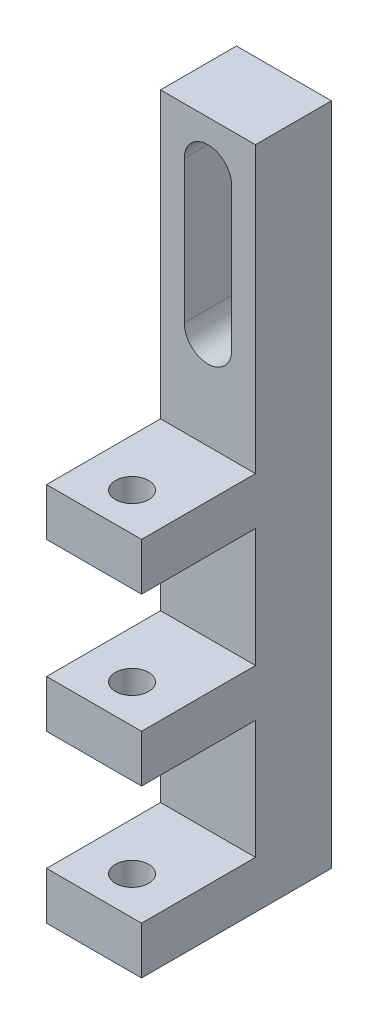
ISO-10303-21;
HEADER;
FILE_DESCRIPTION(('STEP AP214'),'2;1');
FILE_NAME('part.step','',(''),(''),'','','');
FILE_SCHEMA(('AUTOMOTIVE_DESIGN { 1 0 10303 214 1 1 1 1 }'));
ENDSEC;
DATA;
#1=APPLICATION_CONTEXT('core data for automotive mechanical design processes');
#2=APPLICATION_PROTOCOL_DEFINITION('international standard','automotive_design',2000,#1);
#3=PRODUCT_CONTEXT('',#1,'mechanical');
#4=PRODUCT('Part','Part','',(#3));
#5=PRODUCT_RELATED_PRODUCT_CATEGORY('part','',(#4));
#6=PRODUCT_DEFINITION_FORMATION('','',#4);
#7=PRODUCT_DEFINITION_CONTEXT('part definition',#1,'design');
#8=PRODUCT_DEFINITION('design','',#6,#7);
#9=PRODUCT_DEFINITION_SHAPE('','',#8);
#10=(LENGTH_UNIT() NAMED_UNIT(*) SI_UNIT(.MILLI.,.METRE.));
#11=(NAMED_UNIT(*) PLANE_ANGLE_UNIT() SI_UNIT($,.RADIAN.));
#12=(NAMED_UNIT(*) SI_UNIT($,.STERADIAN.) SOLID_ANGLE_UNIT());
#13=UNCERTAINTY_MEASURE_WITH_UNIT(LENGTH_MEASURE(1.E-05),#10,'distance_accuracy_value','');
#14=(GEOMETRIC_REPRESENTATION_CONTEXT(3) GLOBAL_UNCERTAINTY_ASSIGNED_CONTEXT((#13)) GLOBAL_UNIT_ASSIGNED_CONTEXT((#10,
#11,#12)) REPRESENTATION_CONTEXT('',''));
#15=CARTESIAN_POINT('',(0.,0.,0.));
#16=DIRECTION('',(0.,0.,1.));
#17=DIRECTION('',(1.,0.,0.));
#18=AXIS2_PLACEMENT_3D('',#15,#16,#17);
#19=CARTESIAN_POINT('',(0.505617977528097,15.2247191011236,5.));
#20=DIRECTION('',(0.,0.,-1.));
#21=DIRECTION('',(-1.,0.,0.));
#22=AXIS2_PLACEMENT_3D('',#19,#20,#21);
#23=CYLINDRICAL_SURFACE('',#22,2.5);
#24=CARTESIAN_POINT('',(0.505617977528097,15.2247191011236,5.));
#25=DIRECTION('',(0.,0.,1.));
#26=DIRECTION('',(1.,0.,0.));
#27=AXIS2_PLACEMENT_3D('',#24,#25,#26);
#28=CIRCLE('',#27,2.5);
#29=CARTESIAN_POINT('',(-1.9943820224719,15.2247191011236,5.));
#30=VERTEX_POINT('',#29);
#31=CARTESIAN_POINT('',(3.0056179775281,15.2247191011236,5.));
#32=VERTEX_POINT('',#31);
#33=EDGE_CURVE('E316',#30,#32,#28,.T.);
#34=ORIENTED_EDGE('',*,*,#33,.T.);
#35=DIRECTION('',(0.,0.,1.));
#36=VECTOR('',#35,1.);
#37=CARTESIAN_POINT('',(3.0056179775281,15.2247191011236,-3.));
#38=LINE('',#37,#36);
#39=CARTESIAN_POINT('',(3.0056179775281,15.2247191011236,-3.));
#40=VERTEX_POINT('',#39);
#41=EDGE_CURVE('E167',#40,#32,#38,.T.);
#42=ORIENTED_EDGE('',*,*,#41,.F.);
#43=CARTESIAN_POINT('',(0.505617977528097,15.2247191011236,-3.));
#44=DIRECTION('',(0.,0.,1.));
#45=DIRECTION('',(1.,0.,0.));
#46=AXIS2_PLACEMENT_3D('',#43,#44,#45);
#47=CIRCLE('',#46,2.5);
#48=CARTESIAN_POINT('',(-1.9943820224719,15.2247191011236,-3.));
#49=VERTEX_POINT('',#48);
#50=EDGE_CURVE('E163',#40,#49,#47,.F.);
#51=ORIENTED_EDGE('',*,*,#50,.T.);
#52=DIRECTION('',(0.,0.,1.));
#53=VECTOR('',#52,1.);
#54=CARTESIAN_POINT('',(-1.9943820224719,15.2247191011236,-3.));
#55=LINE('',#54,#53);
#56=EDGE_CURVE('E165',#49,#30,#55,.T.);
#57=ORIENTED_EDGE('',*,*,#56,.T.);
#58=EDGE_LOOP('',(#34,#42,#51,#57));
#59=FACE_BOUND('',#58,.T.);
#60=ADVANCED_FACE('F37',(#59),#23,.F.);
#61=CARTESIAN_POINT('',(0.,0.,5.));
#62=DIRECTION('',(0.,0.,1.));
#63=DIRECTION('',(1.,0.,0.));
#64=AXIS2_PLACEMENT_3D('',#61,#62,#63);
#65=PLANE('',#64);
#66=DIRECTION('',(1.,0.,0.));
#67=VECTOR('',#66,1.);
#68=CARTESIAN_POINT('',(0.,5.2247191011236,5.));
#69=LINE('',#68,#67);
#70=CARTESIAN_POINT('',(-4.4943820224719,5.2247191011236,5.));
#71=VERTEX_POINT('',#70);
#72=CARTESIAN_POINT('',(5.5056179775281,5.2247191011236,5.));
#73=VERTEX_POINT('',#72);
#74=EDGE_CURVE('E318',#71,#73,#69,.T.);
#75=ORIENTED_EDGE('',*,*,#74,.T.);
#76=DIRECTION('',(0.,1.,0.));
#77=VECTOR('',#76,1.);
#78=CARTESIAN_POINT('',(5.50561797752809,0.,5.));
#79=LINE('',#78,#77);
#80=CARTESIAN_POINT('',(5.5056179775281,35.2247191011236,5.));
#81=VERTEX_POINT('',#80);
#82=EDGE_CURVE('E45',#73,#81,#79,.T.);
#83=ORIENTED_EDGE('',*,*,#82,.T.);
#84=DIRECTION('',(-1.,0.,0.));
#85=VECTOR('',#84,1.);
#86=CARTESIAN_POINT('',(-4.4943820224719,35.2247191011236,5.));
#87=LINE('',#86,#85);
#88=CARTESIAN_POINT('',(-4.4943820224719,35.2247191011236,5.));
#89=VERTEX_POINT('',#88);
#90=EDGE_CURVE('E197',#81,#89,#87,.T.);
#91=ORIENTED_EDGE('',*,*,#90,.T.);
#92=DIRECTION('',(0.,1.,0.));
#93=VECTOR('',#92,1.);
#94=CARTESIAN_POINT('',(-4.4943820224719,0.,5.));
#95=LINE('',#94,#93);
#96=EDGE_CURVE('E11',#71,#89,#95,.T.);
#97=ORIENTED_EDGE('',*,*,#96,.F.);
#98=EDGE_LOOP('',(#75,#83,#91,#97));
#99=FACE_BOUND('',#98,.T.);
#100=CARTESIAN_POINT('',(0.505617977528097,30.2247191011236,5.));
#101=DIRECTION('',(0.,0.,1.));
#102=DIRECTION('',(1.,0.,0.));
#103=AXIS2_PLACEMENT_3D('',#100,#101,#102);
#104=CIRCLE('',#103,2.5);
#105=CARTESIAN_POINT('',(3.0056179775281,30.2247191011236,5.));
#106=VERTEX_POINT('',#105);
#107=CARTESIAN_POINT('',(-1.9943820224719,30.2247191011236,5.));
#108=VERTEX_POINT('',#107);
#109=EDGE_CURVE('E193',#106,#108,#104,.T.);
#110=ORIENTED_EDGE('',*,*,#109,.F.);
#111=DIRECTION('',(0.,-1.,0.));
#112=VECTOR('',#111,1.);
#113=CARTESIAN_POINT('',(3.0056179775281,0.,5.));
#114=LINE('',#113,#112);
#115=EDGE_CURVE('E183',#106,#32,#114,.T.);
#116=ORIENTED_EDGE('',*,*,#115,.T.);
#117=ORIENTED_EDGE('',*,*,#33,.F.);
#118=DIRECTION('',(0.,-1.,0.));
#119=VECTOR('',#118,1.);
#120=CARTESIAN_POINT('',(-1.9943820224719,0.,5.));
#121=LINE('',#120,#119);
#122=EDGE_CURVE('E175',#108,#30,#121,.T.);
#123=ORIENTED_EDGE('',*,*,#122,.F.);
#124=EDGE_LOOP('',(#110,#116,#117,#123));
#125=FACE_BOUND('',#124,.T.);
#126=ADVANCED_FACE('F323',(#99,#125),#65,.T.);
#127=CARTESIAN_POINT('',(-4.4943820224719,25.2247191011236,-3.));
#128=DIRECTION('',(0.,0.,-1.));
#129=DIRECTION('',(0.,1.,0.));
#130=AXIS2_PLACEMENT_3D('',#127,#128,#129);
#131=PLANE('',#130);
#132=DIRECTION('',(0.,1.,0.));
#133=VECTOR('',#132,1.);
#134=CARTESIAN_POINT('',(5.5056179775281,25.2247191011236,-3.));
#135=LINE('',#134,#133);
#136=CARTESIAN_POINT('',(5.50561797752809,-34.7752808988764,-3.00000000000001));
#137=VERTEX_POINT('',#136);
#138=CARTESIAN_POINT('',(5.5056179775281,35.2247191011236,-3.));
#139=VERTEX_POINT('',#138);
#140=EDGE_CURVE('E209',#137,#139,#135,.T.);
#141=ORIENTED_EDGE('',*,*,#140,.F.);
#142=DIRECTION('',(1.,0.,0.));
#143=VECTOR('',#142,1.);
#144=CARTESIAN_POINT('',(-4.49438202247191,-34.7752808988764,-3.00000000000001));
#145=LINE('',#144,#143);
#146=CARTESIAN_POINT('',(-4.49438202247191,-34.7752808988764,-3.00000000000001));
#147=VERTEX_POINT('',#146);
#148=EDGE_CURVE('E214',#147,#137,#145,.T.);
#149=ORIENTED_EDGE('',*,*,#148,.F.);
#150=DIRECTION('',(0.,1.,0.));
#151=VECTOR('',#150,1.);
#152=CARTESIAN_POINT('',(-4.4943820224719,25.2247191011236,-3.));
#153=LINE('',#152,#151);
#154=CARTESIAN_POINT('',(-4.4943820224719,35.2247191011236,-3.));
#155=VERTEX_POINT('',#154);
#156=EDGE_CURVE('E212',#147,#155,#153,.T.);
#157=ORIENTED_EDGE('',*,*,#156,.T.);
#158=DIRECTION('',(-1.,0.,0.));
#159=VECTOR('',#158,1.);
#160=CARTESIAN_POINT('',(-4.4943820224719,35.2247191011236,-3.));
#161=LINE('',#160,#159);
#162=EDGE_CURVE('E200',#139,#155,#161,.T.);
#163=ORIENTED_EDGE('',*,*,#162,.F.);
#164=EDGE_LOOP('',(#141,#149,#157,#163));
#165=FACE_BOUND('',#164,.T.);
#166=ORIENTED_EDGE('',*,*,#50,.F.);
#167=DIRECTION('',(0.,-1.,0.));
#168=VECTOR('',#167,1.);
#169=CARTESIAN_POINT('',(3.0056179775281,0.,-3.));
#170=LINE('',#169,#168);
#171=CARTESIAN_POINT('',(3.0056179775281,30.2247191011236,-3.));
#172=VERTEX_POINT('',#171);
#173=EDGE_CURVE('E171',#172,#40,#170,.T.);
#174=ORIENTED_EDGE('',*,*,#173,.F.);
#175=CARTESIAN_POINT('',(0.505617977528097,30.2247191011236,-3.));
#176=DIRECTION('',(0.,0.,1.));
#177=DIRECTION('',(1.,0.,0.));
#178=AXIS2_PLACEMENT_3D('',#175,#176,#177);
#179=CIRCLE('',#178,2.5);
#180=CARTESIAN_POINT('',(-1.9943820224719,30.2247191011236,-3.));
#181=VERTEX_POINT('',#180);
#182=EDGE_CURVE('E182',#172,#181,#179,.T.);
#183=ORIENTED_EDGE('',*,*,#182,.T.);
#184=DIRECTION('',(0.,-1.,0.));
#185=VECTOR('',#184,1.);
#186=CARTESIAN_POINT('',(-1.9943820224719,0.,-3.));
#187=LINE('',#186,#185);
#188=EDGE_CURVE('E52',#181,#49,#187,.T.);
#189=ORIENTED_EDGE('',*,*,#188,.T.);
#190=EDGE_LOOP('',(#166,#174,#183,#189));
#191=FACE_BOUND('',#190,.T.);
#192=ADVANCED_FACE('F180',(#165,#191),#131,.T.);
#193=CARTESIAN_POINT('',(0.505617977528097,30.2247191011236,-3.));
#194=DIRECTION('',(0.,0.,1.));
#195=DIRECTION('',(1.,0.,0.));
#196=AXIS2_PLACEMENT_3D('',#193,#194,#195);
#197=CYLINDRICAL_SURFACE('',#196,2.5);
#198=DIRECTION('',(0.,0.,1.));
#199=VECTOR('',#198,1.);
#200=CARTESIAN_POINT('',(3.0056179775281,30.2247191011236,-3.));
#201=LINE('',#200,#199);
#202=EDGE_CURVE('E190',#172,#106,#201,.T.);
#203=ORIENTED_EDGE('',*,*,#202,.T.);
#204=ORIENTED_EDGE('',*,*,#109,.T.);
#205=DIRECTION('',(0.,0.,1.));
#206=VECTOR('',#205,1.);
#207=CARTESIAN_POINT('',(-1.9943820224719,30.2247191011236,-3.));
#208=LINE('',#207,#206);
#209=EDGE_CURVE('E177',#181,#108,#208,.T.);
#210=ORIENTED_EDGE('',*,*,#209,.F.);
#211=ORIENTED_EDGE('',*,*,#182,.F.);
#212=EDGE_LOOP('',(#203,#204,#210,#211));
#213=FACE_BOUND('',#212,.T.);
#214=ADVANCED_FACE('F379',(#213),#197,.F.);
#215=CARTESIAN_POINT('',(5.50561797752809,0.,5.));
#216=DIRECTION('',(-1.,0.,0.));
#217=DIRECTION('',(0.,-1.,0.));
#218=AXIS2_PLACEMENT_3D('',#215,#216,#217);
#219=PLANE('',#218);
#220=DIRECTION('',(0.,0.,-1.));
#221=VECTOR('',#220,1.);
#222=CARTESIAN_POINT('',(5.5056179775281,-34.7752808988764,17.));
#223=LINE('',#222,#221);
#224=CARTESIAN_POINT('',(5.5056179775281,-34.7752808988764,17.));
#225=VERTEX_POINT('',#224);
#226=EDGE_CURVE('E245',#225,#137,#223,.T.);
#227=ORIENTED_EDGE('',*,*,#226,.T.);
#228=ORIENTED_EDGE('',*,*,#140,.T.);
#229=DIRECTION('',(0.,0.,1.));
#230=VECTOR('',#229,1.);
#231=CARTESIAN_POINT('',(5.5056179775281,35.2247191011236,-3.));
#232=LINE('',#231,#230);
#233=EDGE_CURVE('E203',#139,#81,#232,.T.);
#234=ORIENTED_EDGE('',*,*,#233,.T.);
#235=ORIENTED_EDGE('',*,*,#82,.F.);
#236=DIRECTION('',(0.,0.,-1.));
#237=VECTOR('',#236,1.);
#238=CARTESIAN_POINT('',(5.5056179775281,5.2247191011236,17.));
#239=LINE('',#238,#237);
#240=CARTESIAN_POINT('',(5.5056179775281,5.2247191011236,17.));
#241=VERTEX_POINT('',#240);
#242=EDGE_CURVE('E308',#241,#73,#239,.T.);
#243=ORIENTED_EDGE('',*,*,#242,.F.);
#244=DIRECTION('',(0.,-1.,0.));
#245=VECTOR('',#244,1.);
#246=CARTESIAN_POINT('',(5.5056179775281,0.,17.));
#247=LINE('',#246,#245);
#248=CARTESIAN_POINT('',(5.5056179775281,0.224719101123605,17.));
#249=VERTEX_POINT('',#248);
#250=EDGE_CURVE('E299',#241,#249,#247,.T.);
#251=ORIENTED_EDGE('',*,*,#250,.T.);
#252=DIRECTION('',(0.,0.,-1.));
#253=VECTOR('',#252,1.);
#254=CARTESIAN_POINT('',(5.5056179775281,0.224719101123605,17.));
#255=LINE('',#254,#253);
#256=CARTESIAN_POINT('',(5.5056179775281,0.224719101123605,5.));
#257=VERTEX_POINT('',#256);
#258=EDGE_CURVE('E310',#249,#257,#255,.T.);
#259=ORIENTED_EDGE('',*,*,#258,.T.);
#260=DIRECTION('',(0.,-1.,0.));
#261=VECTOR('',#260,1.);
#262=CARTESIAN_POINT('',(5.5056179775281,0.,5.));
#263=LINE('',#262,#261);
#264=CARTESIAN_POINT('',(5.5056179775281,-12.2752808988764,5.));
#265=VERTEX_POINT('',#264);
#266=EDGE_CURVE('E288',#257,#265,#263,.T.);
#267=ORIENTED_EDGE('',*,*,#266,.T.);
#268=DIRECTION('',(0.,0.,-1.));
#269=VECTOR('',#268,1.);
#270=CARTESIAN_POINT('',(5.5056179775281,-12.2752808988764,17.));
#271=LINE('',#270,#269);
#272=CARTESIAN_POINT('',(5.5056179775281,-12.2752808988764,17.));
#273=VERTEX_POINT('',#272);
#274=EDGE_CURVE('E274',#273,#265,#271,.T.);
#275=ORIENTED_EDGE('',*,*,#274,.F.);
#276=DIRECTION('',(0.,-1.,0.));
#277=VECTOR('',#276,1.);
#278=CARTESIAN_POINT('',(5.5056179775281,0.,17.));
#279=LINE('',#278,#277);
#280=CARTESIAN_POINT('',(5.5056179775281,-17.2752808988764,17.));
#281=VERTEX_POINT('',#280);
#282=EDGE_CURVE('E265',#273,#281,#279,.T.);
#283=ORIENTED_EDGE('',*,*,#282,.T.);
#284=DIRECTION('',(0.,0.,-1.));
#285=VECTOR('',#284,1.);
#286=CARTESIAN_POINT('',(5.5056179775281,-17.2752808988764,17.));
#287=LINE('',#286,#285);
#288=CARTESIAN_POINT('',(5.5056179775281,-17.2752808988764,5.));
#289=VERTEX_POINT('',#288);
#290=EDGE_CURVE('E276',#281,#289,#287,.T.);
#291=ORIENTED_EDGE('',*,*,#290,.T.);
#292=DIRECTION('',(0.,-1.,0.));
#293=VECTOR('',#292,1.);
#294=CARTESIAN_POINT('',(5.5056179775281,0.,5.));
#295=LINE('',#294,#293);
#296=CARTESIAN_POINT('',(5.5056179775281,-29.7752808988764,5.));
#297=VERTEX_POINT('',#296);
#298=EDGE_CURVE('E60',#289,#297,#295,.T.);
#299=ORIENTED_EDGE('',*,*,#298,.T.);
#300=DIRECTION('',(0.,0.,-1.));
#301=VECTOR('',#300,1.);
#302=CARTESIAN_POINT('',(5.5056179775281,-29.7752808988764,17.));
#303=LINE('',#302,#301);
#304=CARTESIAN_POINT('',(5.5056179775281,-29.7752808988764,17.));
#305=VERTEX_POINT('',#304);
#306=EDGE_CURVE('E243',#305,#297,#303,.T.);
#307=ORIENTED_EDGE('',*,*,#306,.F.);
#308=DIRECTION('',(0.,-1.,0.));
#309=VECTOR('',#308,1.);
#310=CARTESIAN_POINT('',(5.5056179775281,0.,17.));
#311=LINE('',#310,#309);
#312=EDGE_CURVE('E240',#305,#225,#311,.T.);
#313=ORIENTED_EDGE('',*,*,#312,.T.);
#314=EDGE_LOOP('',(#227,#228,#234,#235,#243,#251,#259,#267,#275,#283,#291,#299,#307,#313));
#315=FACE_BOUND('',#314,.T.);
#316=ADVANCED_FACE('F329',(#315),#219,.F.);
#317=CARTESIAN_POINT('',(-4.4943820224719,0.,5.));
#318=DIRECTION('',(-1.,0.,0.));
#319=DIRECTION('',(0.,0.,1.));
#320=AXIS2_PLACEMENT_3D('',#317,#318,#319);
#321=PLANE('',#320);
#322=ORIENTED_EDGE('',*,*,#96,.T.);
#323=DIRECTION('',(0.,0.,1.));
#324=VECTOR('',#323,1.);
#325=CARTESIAN_POINT('',(-4.4943820224719,35.2247191011236,-3.));
#326=LINE('',#325,#324);
#327=EDGE_CURVE('E206',#155,#89,#326,.T.);
#328=ORIENTED_EDGE('',*,*,#327,.F.);
#329=ORIENTED_EDGE('',*,*,#156,.F.);
#330=DIRECTION('',(0.,0.,-1.));
#331=VECTOR('',#330,1.);
#332=CARTESIAN_POINT('',(-4.4943820224719,-34.7752808988764,17.));
#333=LINE('',#332,#331);
#334=CARTESIAN_POINT('',(-4.4943820224719,-34.7752808988764,17.));
#335=VERTEX_POINT('',#334);
#336=EDGE_CURVE('E247',#335,#147,#333,.T.);
#337=ORIENTED_EDGE('',*,*,#336,.F.);
#338=DIRECTION('',(0.,-1.,0.));
#339=VECTOR('',#338,1.);
#340=CARTESIAN_POINT('',(-4.4943820224719,0.,17.));
#341=LINE('',#340,#339);
#342=CARTESIAN_POINT('',(-4.4943820224719,-29.7752808988764,17.));
#343=VERTEX_POINT('',#342);
#344=EDGE_CURVE('E236',#343,#335,#341,.T.);
#345=ORIENTED_EDGE('',*,*,#344,.F.);
#346=DIRECTION('',(0.,0.,-1.));
#347=VECTOR('',#346,1.);
#348=CARTESIAN_POINT('',(-4.4943820224719,-29.7752808988764,17.));
#349=LINE('',#348,#347);
#350=CARTESIAN_POINT('',(-4.4943820224719,-29.7752808988764,5.));
#351=VERTEX_POINT('',#350);
#352=EDGE_CURVE('E249',#343,#351,#349,.T.);
#353=ORIENTED_EDGE('',*,*,#352,.T.);
#354=DIRECTION('',(0.,-1.,0.));
#355=VECTOR('',#354,1.);
#356=CARTESIAN_POINT('',(-4.4943820224719,0.,5.));
#357=LINE('',#356,#355);
#358=CARTESIAN_POINT('',(-4.4943820224719,-17.2752808988764,5.));
#359=VERTEX_POINT('',#358);
#360=EDGE_CURVE('E254',#359,#351,#357,.T.);
#361=ORIENTED_EDGE('',*,*,#360,.F.);
#362=DIRECTION('',(0.,0.,-1.));
#363=VECTOR('',#362,1.);
#364=CARTESIAN_POINT('',(-4.4943820224719,-17.2752808988764,17.));
#365=LINE('',#364,#363);
#366=CARTESIAN_POINT('',(-4.4943820224719,-17.2752808988764,17.));
#367=VERTEX_POINT('',#366);
#368=EDGE_CURVE('E279',#367,#359,#365,.T.);
#369=ORIENTED_EDGE('',*,*,#368,.F.);
#370=DIRECTION('',(0.,-1.,0.));
#371=VECTOR('',#370,1.);
#372=CARTESIAN_POINT('',(-4.4943820224719,0.,17.));
#373=LINE('',#372,#371);
#374=CARTESIAN_POINT('',(-4.4943820224719,-12.2752808988764,17.));
#375=VERTEX_POINT('',#374);
#376=EDGE_CURVE('E260',#375,#367,#373,.T.);
#377=ORIENTED_EDGE('',*,*,#376,.F.);
#378=DIRECTION('',(0.,0.,-1.));
#379=VECTOR('',#378,1.);
#380=CARTESIAN_POINT('',(-4.4943820224719,-12.2752808988764,17.));
#381=LINE('',#380,#379);
#382=CARTESIAN_POINT('',(-4.4943820224719,-12.2752808988764,5.));
#383=VERTEX_POINT('',#382);
#384=EDGE_CURVE('E271',#375,#383,#381,.T.);
#385=ORIENTED_EDGE('',*,*,#384,.T.);
#386=DIRECTION('',(0.,-1.,0.));
#387=VECTOR('',#386,1.);
#388=CARTESIAN_POINT('',(-4.4943820224719,0.,5.));
#389=LINE('',#388,#387);
#390=CARTESIAN_POINT('',(-4.4943820224719,0.224719101123605,5.));
#391=VERTEX_POINT('',#390);
#392=EDGE_CURVE('E282',#391,#383,#389,.T.);
#393=ORIENTED_EDGE('',*,*,#392,.F.);
#394=DIRECTION('',(0.,0.,-1.));
#395=VECTOR('',#394,1.);
#396=CARTESIAN_POINT('',(-4.4943820224719,0.224719101123605,17.));
#397=LINE('',#396,#395);
#398=CARTESIAN_POINT('',(-4.4943820224719,0.224719101123605,17.));
#399=VERTEX_POINT('',#398);
#400=EDGE_CURVE('E313',#399,#391,#397,.T.);
#401=ORIENTED_EDGE('',*,*,#400,.F.);
#402=DIRECTION('',(0.,-1.,0.));
#403=VECTOR('',#402,1.);
#404=CARTESIAN_POINT('',(-4.4943820224719,0.,17.));
#405=LINE('',#404,#403);
#406=CARTESIAN_POINT('',(-4.4943820224719,5.2247191011236,17.));
#407=VERTEX_POINT('',#406);
#408=EDGE_CURVE('E294',#407,#399,#405,.T.);
#409=ORIENTED_EDGE('',*,*,#408,.F.);
#410=DIRECTION('',(0.,0.,-1.));
#411=VECTOR('',#410,1.);
#412=CARTESIAN_POINT('',(-4.4943820224719,5.2247191011236,17.));
#413=LINE('',#412,#411);
#414=EDGE_CURVE('E305',#407,#71,#413,.T.);
#415=ORIENTED_EDGE('',*,*,#414,.T.);
#416=EDGE_LOOP('',(#322,#328,#329,#337,#345,#353,#361,#369,#377,#385,#393,#401,#409,#415));
#417=FACE_BOUND('',#416,.T.);
#418=ADVANCED_FACE('F337',(#417),#321,.T.);
#419=CARTESIAN_POINT('',(0.,5.2247191011236,17.));
#420=DIRECTION('',(0.,1.,0.));
#421=DIRECTION('',(0.,0.,1.));
#422=AXIS2_PLACEMENT_3D('',#419,#420,#421);
#423=PLANE('',#422);
#424=CARTESIAN_POINT('',(0.505617977528097,5.2247191011236,13.));
#425=DIRECTION('',(0.,1.,0.));
#426=DIRECTION('',(0.,0.,1.));
#427=AXIS2_PLACEMENT_3D('',#424,#425,#426);
#428=CIRCLE('',#427,1.75);
#429=CARTESIAN_POINT('',(0.505617977528097,5.2247191011236,14.75));
#430=VERTEX_POINT('',#429);
#431=EDGE_CURVE('E218',#430,#430,#428,.T.);
#432=ORIENTED_EDGE('',*,*,#431,.F.);
#433=EDGE_LOOP('',(#432));
#434=FACE_BOUND('',#433,.T.);
#435=ORIENTED_EDGE('',*,*,#74,.F.);
#436=ORIENTED_EDGE('',*,*,#414,.F.);
#437=DIRECTION('',(1.,0.,0.));
#438=VECTOR('',#437,1.);
#439=CARTESIAN_POINT('',(0.,5.2247191011236,17.));
#440=LINE('',#439,#438);
#441=EDGE_CURVE('E302',#407,#241,#440,.T.);
#442=ORIENTED_EDGE('',*,*,#441,.T.);
#443=ORIENTED_EDGE('',*,*,#242,.T.);
#444=EDGE_LOOP('',(#435,#436,#442,#443));
#445=FACE_BOUND('',#444,.T.);
#446=ADVANCED_FACE('F343',(#434,#445),#423,.T.);
#447=CARTESIAN_POINT('',(0.,0.224719101123605,17.));
#448=DIRECTION('',(0.,1.,0.));
#449=DIRECTION('',(0.,0.,1.));
#450=AXIS2_PLACEMENT_3D('',#447,#448,#449);
#451=PLANE('',#450);
#452=CARTESIAN_POINT('',(0.505617977528097,0.224719101123608,13.));
#453=DIRECTION('',(0.,1.,0.));
#454=DIRECTION('',(0.,0.,1.));
#455=AXIS2_PLACEMENT_3D('',#452,#453,#454);
#456=CIRCLE('',#455,1.75);
#457=CARTESIAN_POINT('',(0.505617977528097,0.224719101123608,14.75));
#458=VERTEX_POINT('',#457);
#459=EDGE_CURVE('E230',#458,#458,#456,.T.);
#460=ORIENTED_EDGE('',*,*,#459,.T.);
#461=EDGE_LOOP('',(#460));
#462=FACE_BOUND('',#461,.T.);
#463=ORIENTED_EDGE('',*,*,#400,.T.);
#464=DIRECTION('',(1.,0.,0.));
#465=VECTOR('',#464,1.);
#466=CARTESIAN_POINT('',(0.,0.224719101123605,5.));
#467=LINE('',#466,#465);
#468=EDGE_CURVE('E291',#391,#257,#467,.T.);
#469=ORIENTED_EDGE('',*,*,#468,.T.);
#470=ORIENTED_EDGE('',*,*,#258,.F.);
#471=DIRECTION('',(1.,0.,0.));
#472=VECTOR('',#471,1.);
#473=CARTESIAN_POINT('',(0.,0.224719101123605,17.));
#474=LINE('',#473,#472);
#475=EDGE_CURVE('E297',#399,#249,#474,.T.);
#476=ORIENTED_EDGE('',*,*,#475,.F.);
#477=EDGE_LOOP('',(#463,#469,#470,#476));
#478=FACE_BOUND('',#477,.T.);
#479=ADVANCED_FACE('F349',(#462,#478),#451,.F.);
#480=CARTESIAN_POINT('',(0.,0.,17.));
#481=DIRECTION('',(0.,0.,1.));
#482=DIRECTION('',(1.,0.,0.));
#483=AXIS2_PLACEMENT_3D('',#480,#481,#482);
#484=PLANE('',#483);
#485=ORIENTED_EDGE('',*,*,#408,.T.);
#486=ORIENTED_EDGE('',*,*,#475,.T.);
#487=ORIENTED_EDGE('',*,*,#250,.F.);
#488=ORIENTED_EDGE('',*,*,#441,.F.);
#489=EDGE_LOOP('',(#485,#486,#487,#488));
#490=FACE_BOUND('',#489,.T.);
#491=ADVANCED_FACE('F346',(#490),#484,.T.);
#492=CARTESIAN_POINT('',(0.,0.,5.));
#493=DIRECTION('',(0.,0.,1.));
#494=DIRECTION('',(1.,0.,0.));
#495=AXIS2_PLACEMENT_3D('',#492,#493,#494);
#496=PLANE('',#495);
#497=ORIENTED_EDGE('',*,*,#392,.T.);
#498=DIRECTION('',(1.,0.,0.));
#499=VECTOR('',#498,1.);
#500=CARTESIAN_POINT('',(0.,-12.2752808988764,5.));
#501=LINE('',#500,#499);
#502=EDGE_CURVE('E285',#383,#265,#501,.T.);
#503=ORIENTED_EDGE('',*,*,#502,.T.);
#504=ORIENTED_EDGE('',*,*,#266,.F.);
#505=ORIENTED_EDGE('',*,*,#468,.F.);
#506=EDGE_LOOP('',(#497,#503,#504,#505));
#507=FACE_BOUND('',#506,.T.);
#508=ADVANCED_FACE('F353',(#507),#496,.T.);
#509=CARTESIAN_POINT('',(0.,-12.2752808988764,17.));
#510=DIRECTION('',(0.,1.,0.));
#511=DIRECTION('',(0.,0.,1.));
#512=AXIS2_PLACEMENT_3D('',#509,#510,#511);
#513=PLANE('',#512);
#514=CARTESIAN_POINT('',(0.505617977528097,-12.2752808988764,13.));
#515=DIRECTION('',(0.,1.,0.));
#516=DIRECTION('',(0.,0.,1.));
#517=AXIS2_PLACEMENT_3D('',#514,#515,#516);
#518=CIRCLE('',#517,1.75);
#519=CARTESIAN_POINT('',(0.505617977528097,-12.2752808988764,14.75));
#520=VERTEX_POINT('',#519);
#521=EDGE_CURVE('E227',#520,#520,#518,.T.);
#522=ORIENTED_EDGE('',*,*,#521,.F.);
#523=EDGE_LOOP('',(#522));
#524=FACE_BOUND('',#523,.T.);
#525=ORIENTED_EDGE('',*,*,#502,.F.);
#526=ORIENTED_EDGE('',*,*,#384,.F.);
#527=DIRECTION('',(1.,0.,0.));
#528=VECTOR('',#527,1.);
#529=CARTESIAN_POINT('',(0.,-12.2752808988764,17.));
#530=LINE('',#529,#528);
#531=EDGE_CURVE('E268',#375,#273,#530,.T.);
#532=ORIENTED_EDGE('',*,*,#531,.T.);
#533=ORIENTED_EDGE('',*,*,#274,.T.);
#534=EDGE_LOOP('',(#525,#526,#532,#533));
#535=FACE_BOUND('',#534,.T.);
#536=ADVANCED_FACE('F355',(#524,#535),#513,.T.);
#537=CARTESIAN_POINT('',(0.,-17.2752808988764,17.));
#538=DIRECTION('',(0.,1.,0.));
#539=DIRECTION('',(0.,0.,1.));
#540=AXIS2_PLACEMENT_3D('',#537,#538,#539);
#541=PLANE('',#540);
#542=CARTESIAN_POINT('',(0.505617977528097,-17.2752808988764,13.));
#543=DIRECTION('',(0.,1.,0.));
#544=DIRECTION('',(0.,0.,1.));
#545=AXIS2_PLACEMENT_3D('',#542,#543,#544);
#546=CIRCLE('',#545,1.75);
#547=CARTESIAN_POINT('',(0.505617977528097,-17.2752808988764,14.75));
#548=VERTEX_POINT('',#547);
#549=EDGE_CURVE('E224',#548,#548,#546,.T.);
#550=ORIENTED_EDGE('',*,*,#549,.T.);
#551=EDGE_LOOP('',(#550));
#552=FACE_BOUND('',#551,.T.);
#553=ORIENTED_EDGE('',*,*,#368,.T.);
#554=DIRECTION('',(1.,0.,0.));
#555=VECTOR('',#554,1.);
#556=CARTESIAN_POINT('',(0.,-17.2752808988764,5.));
#557=LINE('',#556,#555);
#558=EDGE_CURVE('E252',#359,#289,#557,.T.);
#559=ORIENTED_EDGE('',*,*,#558,.T.);
#560=ORIENTED_EDGE('',*,*,#290,.F.);
#561=DIRECTION('',(1.,0.,0.));
#562=VECTOR('',#561,1.);
#563=CARTESIAN_POINT('',(0.,-17.2752808988764,17.));
#564=LINE('',#563,#562);
#565=EDGE_CURVE('E263',#367,#281,#564,.T.);
#566=ORIENTED_EDGE('',*,*,#565,.F.);
#567=EDGE_LOOP('',(#553,#559,#560,#566));
#568=FACE_BOUND('',#567,.T.);
#569=ADVANCED_FACE('F363',(#552,#568),#541,.F.);
#570=CARTESIAN_POINT('',(0.,0.,17.));
#571=DIRECTION('',(0.,0.,1.));
#572=DIRECTION('',(1.,0.,0.));
#573=AXIS2_PLACEMENT_3D('',#570,#571,#572);
#574=PLANE('',#573);
#575=ORIENTED_EDGE('',*,*,#376,.T.);
#576=ORIENTED_EDGE('',*,*,#565,.T.);
#577=ORIENTED_EDGE('',*,*,#282,.F.);
#578=ORIENTED_EDGE('',*,*,#531,.F.);
#579=EDGE_LOOP('',(#575,#576,#577,#578));
#580=FACE_BOUND('',#579,.T.);
#581=ADVANCED_FACE('F360',(#580),#574,.T.);
#582=CARTESIAN_POINT('',(0.,0.,5.));
#583=DIRECTION('',(0.,0.,1.));
#584=DIRECTION('',(1.,0.,0.));
#585=AXIS2_PLACEMENT_3D('',#582,#583,#584);
#586=PLANE('',#585);
#587=ORIENTED_EDGE('',*,*,#558,.F.);
#588=ORIENTED_EDGE('',*,*,#360,.T.);
#589=DIRECTION('',(1.,0.,0.));
#590=VECTOR('',#589,1.);
#591=CARTESIAN_POINT('',(0.,-29.7752808988764,5.));
#592=LINE('',#591,#590);
#593=EDGE_CURVE('E257',#351,#297,#592,.T.);
#594=ORIENTED_EDGE('',*,*,#593,.T.);
#595=ORIENTED_EDGE('',*,*,#298,.F.);
#596=EDGE_LOOP('',(#587,#588,#594,#595));
#597=FACE_BOUND('',#596,.T.);
#598=ADVANCED_FACE('F364',(#597),#586,.T.);
#599=CARTESIAN_POINT('',(0.,-29.7752808988764,17.));
#600=DIRECTION('',(0.,1.,0.));
#601=DIRECTION('',(0.,0.,1.));
#602=AXIS2_PLACEMENT_3D('',#599,#600,#601);
#603=PLANE('',#602);
#604=CARTESIAN_POINT('',(0.505617977528097,-29.7752808988764,13.));
#605=DIRECTION('',(0.,1.,0.));
#606=DIRECTION('',(0.,0.,1.));
#607=AXIS2_PLACEMENT_3D('',#604,#605,#606);
#608=CIRCLE('',#607,1.75);
#609=CARTESIAN_POINT('',(0.505617977528097,-29.7752808988764,14.75));
#610=VERTEX_POINT('',#609);
#611=EDGE_CURVE('E221',#610,#610,#608,.T.);
#612=ORIENTED_EDGE('',*,*,#611,.F.);
#613=EDGE_LOOP('',(#612));
#614=FACE_BOUND('',#613,.T.);
#615=ORIENTED_EDGE('',*,*,#593,.F.);
#616=ORIENTED_EDGE('',*,*,#352,.F.);
#617=DIRECTION('',(1.,0.,0.));
#618=VECTOR('',#617,1.);
#619=CARTESIAN_POINT('',(0.,-29.7752808988764,17.));
#620=LINE('',#619,#618);
#621=EDGE_CURVE('E233',#343,#305,#620,.T.);
#622=ORIENTED_EDGE('',*,*,#621,.T.);
#623=ORIENTED_EDGE('',*,*,#306,.T.);
#624=EDGE_LOOP('',(#615,#616,#622,#623));
#625=FACE_BOUND('',#624,.T.);
#626=ADVANCED_FACE('F368',(#614,#625),#603,.T.);
#627=CARTESIAN_POINT('',(0.,-34.7752808988764,17.));
#628=DIRECTION('',(0.,1.,0.));
#629=DIRECTION('',(0.,0.,1.));
#630=AXIS2_PLACEMENT_3D('',#627,#628,#629);
#631=PLANE('',#630);
#632=CARTESIAN_POINT('',(0.505617977528097,-34.7752808988764,13.));
#633=DIRECTION('',(0.,1.,0.));
#634=DIRECTION('',(0.,0.,1.));
#635=AXIS2_PLACEMENT_3D('',#632,#633,#634);
#636=CIRCLE('',#635,1.75);
#637=CARTESIAN_POINT('',(0.505617977528097,-34.7752808988764,14.75));
#638=VERTEX_POINT('',#637);
#639=EDGE_CURVE('E40',#638,#638,#636,.T.);
#640=ORIENTED_EDGE('',*,*,#639,.T.);
#641=EDGE_LOOP('',(#640));
#642=FACE_BOUND('',#641,.T.);
#643=ORIENTED_EDGE('',*,*,#336,.T.);
#644=ORIENTED_EDGE('',*,*,#148,.T.);
#645=ORIENTED_EDGE('',*,*,#226,.F.);
#646=DIRECTION('',(1.,0.,0.));
#647=VECTOR('',#646,1.);
#648=CARTESIAN_POINT('',(0.,-34.7752808988764,17.));
#649=LINE('',#648,#647);
#650=EDGE_CURVE('E238',#335,#225,#649,.T.);
#651=ORIENTED_EDGE('',*,*,#650,.F.);
#652=EDGE_LOOP('',(#643,#644,#645,#651));
#653=FACE_BOUND('',#652,.T.);
#654=ADVANCED_FACE('F375',(#642,#653),#631,.F.);
#655=CARTESIAN_POINT('',(0.,0.,17.));
#656=DIRECTION('',(0.,0.,1.));
#657=DIRECTION('',(1.,0.,0.));
#658=AXIS2_PLACEMENT_3D('',#655,#656,#657);
#659=PLANE('',#658);
#660=ORIENTED_EDGE('',*,*,#621,.F.);
#661=ORIENTED_EDGE('',*,*,#344,.T.);
#662=ORIENTED_EDGE('',*,*,#650,.T.);
#663=ORIENTED_EDGE('',*,*,#312,.F.);
#664=EDGE_LOOP('',(#660,#661,#662,#663));
#665=FACE_BOUND('',#664,.T.);
#666=ADVANCED_FACE('F372',(#665),#659,.T.);
#667=CARTESIAN_POINT('',(0.505617977528097,-43.7752808988764,13.));
#668=DIRECTION('',(0.,1.,0.));
#669=DIRECTION('',(0.,0.,1.));
#670=AXIS2_PLACEMENT_3D('',#667,#668,#669);
#671=CYLINDRICAL_SURFACE('',#670,1.75);
#672=ORIENTED_EDGE('',*,*,#611,.T.);
#673=EDGE_LOOP('',(#672));
#674=FACE_BOUND('',#673,.T.);
#675=ORIENTED_EDGE('',*,*,#639,.F.);
#676=EDGE_LOOP('',(#675));
#677=FACE_BOUND('',#676,.T.);
#678=ADVANCED_FACE('F445',(#674,#677),#671,.F.);
#679=ORIENTED_EDGE('',*,*,#521,.T.);
#680=EDGE_LOOP('',(#679));
#681=FACE_BOUND('',#680,.T.);
#682=ORIENTED_EDGE('',*,*,#549,.F.);
#683=EDGE_LOOP('',(#682));
#684=FACE_BOUND('',#683,.T.);
#685=ADVANCED_FACE('F443',(#681,#684),#671,.F.);
#686=ORIENTED_EDGE('',*,*,#431,.T.);
#687=EDGE_LOOP('',(#686));
#688=FACE_BOUND('',#687,.T.);
#689=ORIENTED_EDGE('',*,*,#459,.F.);
#690=EDGE_LOOP('',(#689));
#691=FACE_BOUND('',#690,.T.);
#692=ADVANCED_FACE('F398',(#688,#691),#671,.F.);
#693=CARTESIAN_POINT('',(-4.4943820224719,35.2247191011236,-3.));
#694=DIRECTION('',(0.,1.,0.));
#695=DIRECTION('',(0.,0.,1.));
#696=AXIS2_PLACEMENT_3D('',#693,#694,#695);
#697=PLANE('',#696);
#698=ORIENTED_EDGE('',*,*,#90,.F.);
#699=ORIENTED_EDGE('',*,*,#233,.F.);
#700=ORIENTED_EDGE('',*,*,#162,.T.);
#701=ORIENTED_EDGE('',*,*,#327,.T.);
#702=EDGE_LOOP('',(#698,#699,#700,#701));
#703=FACE_BOUND('',#702,.T.);
#704=ADVANCED_FACE('F333',(#703),#697,.T.);
#705=CARTESIAN_POINT('',(3.0056179775281,0.,-3.));
#706=DIRECTION('',(-1.,0.,0.));
#707=DIRECTION('',(0.,-1.,0.));
#708=AXIS2_PLACEMENT_3D('',#705,#706,#707);
#709=PLANE('',#708);
#710=ORIENTED_EDGE('',*,*,#115,.F.);
#711=ORIENTED_EDGE('',*,*,#202,.F.);
#712=ORIENTED_EDGE('',*,*,#173,.T.);
#713=ORIENTED_EDGE('',*,*,#41,.T.);
#714=EDGE_LOOP('',(#710,#711,#712,#713));
#715=FACE_BOUND('',#714,.T.);
#716=ADVANCED_FACE('F423',(#715),#709,.T.);
#717=CARTESIAN_POINT('',(-1.9943820224719,0.,-3.));
#718=DIRECTION('',(-1.,0.,0.));
#719=DIRECTION('',(0.,-1.,0.));
#720=AXIS2_PLACEMENT_3D('',#717,#718,#719);
#721=PLANE('',#720);
#722=ORIENTED_EDGE('',*,*,#122,.T.);
#723=ORIENTED_EDGE('',*,*,#56,.F.);
#724=ORIENTED_EDGE('',*,*,#188,.F.);
#725=ORIENTED_EDGE('',*,*,#209,.T.);
#726=EDGE_LOOP('',(#722,#723,#724,#725));
#727=FACE_BOUND('',#726,.T.);
#728=ADVANCED_FACE('F173',(#727),#721,.F.);
#729=CLOSED_SHELL('',(#60,#126,#192,#214,#316,#418,#446,#479,#491,#508,#536,#569,#581,#598,#626,
#654,#666,#678,#685,#692,#704,#716,#728));
#730=MANIFOLD_SOLID_BREP('B2',#729);
#731=ADVANCED_BREP_SHAPE_REPRESENTATION('',(#18,#730),#14);
#732=SHAPE_DEFINITION_REPRESENTATION(#9,#731);
ENDSEC;
END-ISO-10303-21;
